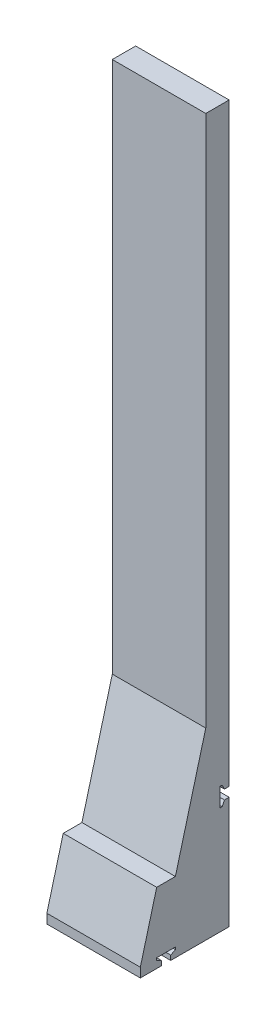
ISO-10303-21;
HEADER;
FILE_DESCRIPTION(('STEP AP214'),'2;1');
FILE_NAME('part.step','',(''),(''),'','','');
FILE_SCHEMA(('AUTOMOTIVE_DESIGN { 1 0 10303 214 1 1 1 1 }'));
ENDSEC;
DATA;
#1=APPLICATION_CONTEXT('core data for automotive mechanical design processes');
#2=APPLICATION_PROTOCOL_DEFINITION('international standard','automotive_design',2000,#1);
#3=PRODUCT_CONTEXT('',#1,'mechanical');
#4=PRODUCT('Part','Part','',(#3));
#5=PRODUCT_RELATED_PRODUCT_CATEGORY('part','',(#4));
#6=PRODUCT_DEFINITION_FORMATION('','',#4);
#7=PRODUCT_DEFINITION_CONTEXT('part definition',#1,'design');
#8=PRODUCT_DEFINITION('design','',#6,#7);
#9=PRODUCT_DEFINITION_SHAPE('','',#8);
#10=(LENGTH_UNIT() NAMED_UNIT(*) SI_UNIT(.MILLI.,.METRE.));
#11=(NAMED_UNIT(*) PLANE_ANGLE_UNIT() SI_UNIT($,.RADIAN.));
#12=(NAMED_UNIT(*) SI_UNIT($,.STERADIAN.) SOLID_ANGLE_UNIT());
#13=UNCERTAINTY_MEASURE_WITH_UNIT(LENGTH_MEASURE(1.E-05),#10,'distance_accuracy_value','');
#14=(GEOMETRIC_REPRESENTATION_CONTEXT(3) GLOBAL_UNCERTAINTY_ASSIGNED_CONTEXT((#13)) GLOBAL_UNIT_ASSIGNED_CONTEXT((#10,
#11,#12)) REPRESENTATION_CONTEXT('',''));
#15=CARTESIAN_POINT('',(0.,0.,0.));
#16=DIRECTION('',(0.,0.,1.));
#17=DIRECTION('',(1.,0.,0.));
#18=AXIS2_PLACEMENT_3D('',#15,#16,#17);
#19=CARTESIAN_POINT('',(1250.,50.,177.5));
#20=DIRECTION('',(0.,1.,0.));
#21=DIRECTION('',(0.,0.,1.));
#22=AXIS2_PLACEMENT_3D('',#19,#20,#21);
#23=PLANE('',#22);
#24=DIRECTION('',(0.,0.,-1.));
#25=VECTOR('',#24,1.);
#26=CARTESIAN_POINT('',(1150.,50.,177.5));
#27=LINE('',#26,#25);
#28=CARTESIAN_POINT('',(1150.,50.,200.));
#29=VERTEX_POINT('',#28);
#30=CARTESIAN_POINT('',(1150.,50.,177.5));
#31=VERTEX_POINT('',#30);
#32=EDGE_CURVE('E229',#29,#31,#27,.T.);
#33=ORIENTED_EDGE('',*,*,#32,.T.);
#34=DIRECTION('',(-1.,0.,0.));
#35=VECTOR('',#34,1.);
#36=CARTESIAN_POINT('',(1250.,50.,177.5));
#37=LINE('',#36,#35);
#38=CARTESIAN_POINT('',(1250.,50.,177.5));
#39=VERTEX_POINT('',#38);
#40=EDGE_CURVE('E11',#39,#31,#37,.T.);
#41=ORIENTED_EDGE('',*,*,#40,.F.);
#42=DIRECTION('',(0.,0.,-1.));
#43=VECTOR('',#42,1.);
#44=CARTESIAN_POINT('',(1250.,50.,177.5));
#45=LINE('',#44,#43);
#46=CARTESIAN_POINT('',(1250.,50.,200.));
#47=VERTEX_POINT('',#46);
#48=EDGE_CURVE('E275',#47,#39,#45,.T.);
#49=ORIENTED_EDGE('',*,*,#48,.F.);
#50=DIRECTION('',(-1.,0.,0.));
#51=VECTOR('',#50,1.);
#52=CARTESIAN_POINT('',(1250.,50.,200.));
#53=LINE('',#52,#51);
#54=EDGE_CURVE('E225',#47,#29,#53,.T.);
#55=ORIENTED_EDGE('',*,*,#54,.T.);
#56=EDGE_LOOP('',(#33,#41,#49,#55));
#57=FACE_BOUND('',#56,.T.);
#58=ADVANCED_FACE('F37',(#57),#23,.F.);
#59=CARTESIAN_POINT('',(1250.,55.,177.5));
#60=DIRECTION('',(0.,0.,1.));
#61=DIRECTION('',(1.,0.,0.));
#62=AXIS2_PLACEMENT_3D('',#59,#60,#61);
#63=PLANE('',#62);
#64=DIRECTION('',(0.,1.,0.));
#65=VECTOR('',#64,1.);
#66=CARTESIAN_POINT('',(1150.,55.,177.5));
#67=LINE('',#66,#65);
#68=CARTESIAN_POINT('',(1150.,55.,177.5));
#69=VERTEX_POINT('',#68);
#70=EDGE_CURVE('E232',#31,#69,#67,.T.);
#71=ORIENTED_EDGE('',*,*,#70,.T.);
#72=DIRECTION('',(-1.,0.,0.));
#73=VECTOR('',#72,1.);
#74=CARTESIAN_POINT('',(1250.,55.,177.5));
#75=LINE('',#74,#73);
#76=CARTESIAN_POINT('',(1250.,55.,177.5));
#77=VERTEX_POINT('',#76);
#78=EDGE_CURVE('E45',#77,#69,#75,.T.);
#79=ORIENTED_EDGE('',*,*,#78,.F.);
#80=DIRECTION('',(0.,1.,0.));
#81=VECTOR('',#80,1.);
#82=CARTESIAN_POINT('',(1250.,55.,177.5));
#83=LINE('',#82,#81);
#84=EDGE_CURVE('E144',#39,#77,#83,.T.);
#85=ORIENTED_EDGE('',*,*,#84,.F.);
#86=ORIENTED_EDGE('',*,*,#40,.T.);
#87=EDGE_LOOP('',(#71,#79,#85,#86));
#88=FACE_BOUND('',#87,.T.);
#89=ADVANCED_FACE('F413',(#88),#63,.F.);
#90=CARTESIAN_POINT('',(1250.,57.5,182.5));
#91=DIRECTION('',(0.,-0.894427190999916,0.447213595499958));
#92=DIRECTION('',(0.,-0.447213595499958,-0.894427190999916));
#93=AXIS2_PLACEMENT_3D('',#90,#91,#92);
#94=PLANE('',#93);
#95=DIRECTION('',(0.,0.447213595499958,0.894427190999916));
#96=VECTOR('',#95,1.);
#97=CARTESIAN_POINT('',(1150.,57.5,182.5));
#98=LINE('',#97,#96);
#99=CARTESIAN_POINT('',(1150.,57.5,182.5));
#100=VERTEX_POINT('',#99);
#101=EDGE_CURVE('E234',#69,#100,#98,.T.);
#102=ORIENTED_EDGE('',*,*,#101,.T.);
#103=DIRECTION('',(-1.,0.,0.));
#104=VECTOR('',#103,1.);
#105=CARTESIAN_POINT('',(1250.,57.5,182.5));
#106=LINE('',#105,#104);
#107=CARTESIAN_POINT('',(1250.,57.5,182.5));
#108=VERTEX_POINT('',#107);
#109=EDGE_CURVE('E330',#108,#100,#106,.T.);
#110=ORIENTED_EDGE('',*,*,#109,.F.);
#111=DIRECTION('',(0.,0.447213595499958,0.894427190999916));
#112=VECTOR('',#111,1.);
#113=CARTESIAN_POINT('',(1250.,57.5,182.5));
#114=LINE('',#113,#112);
#115=EDGE_CURVE('E338',#77,#108,#114,.T.);
#116=ORIENTED_EDGE('',*,*,#115,.F.);
#117=ORIENTED_EDGE('',*,*,#78,.T.);
#118=EDGE_LOOP('',(#102,#110,#116,#117));
#119=FACE_BOUND('',#118,.T.);
#120=ADVANCED_FACE('F336',(#119),#94,.F.);
#121=CARTESIAN_POINT('',(1250.,60.,182.5));
#122=DIRECTION('',(0.,0.,1.));
#123=DIRECTION('',(1.,0.,0.));
#124=AXIS2_PLACEMENT_3D('',#121,#122,#123);
#125=PLANE('',#124);
#126=DIRECTION('',(0.,1.,0.));
#127=VECTOR('',#126,1.);
#128=CARTESIAN_POINT('',(1150.,60.,182.5));
#129=LINE('',#128,#127);
#130=CARTESIAN_POINT('',(1150.,60.,182.5));
#131=VERTEX_POINT('',#130);
#132=EDGE_CURVE('E236',#100,#131,#129,.T.);
#133=ORIENTED_EDGE('',*,*,#132,.T.);
#134=DIRECTION('',(-1.,0.,0.));
#135=VECTOR('',#134,1.);
#136=CARTESIAN_POINT('',(1250.,60.,182.5));
#137=LINE('',#136,#135);
#138=CARTESIAN_POINT('',(1250.,60.,182.5));
#139=VERTEX_POINT('',#138);
#140=EDGE_CURVE('E327',#139,#131,#137,.T.);
#141=ORIENTED_EDGE('',*,*,#140,.F.);
#142=DIRECTION('',(0.,1.,0.));
#143=VECTOR('',#142,1.);
#144=CARTESIAN_POINT('',(1250.,60.,182.5));
#145=LINE('',#144,#143);
#146=EDGE_CURVE('E356',#108,#139,#145,.T.);
#147=ORIENTED_EDGE('',*,*,#146,.F.);
#148=ORIENTED_EDGE('',*,*,#109,.T.);
#149=EDGE_LOOP('',(#133,#141,#147,#148));
#150=FACE_BOUND('',#149,.T.);
#151=ADVANCED_FACE('F347',(#150),#125,.F.);
#152=CARTESIAN_POINT('',(1250.,60.,162.5));
#153=DIRECTION('',(0.,1.,0.));
#154=DIRECTION('',(0.,0.,1.));
#155=AXIS2_PLACEMENT_3D('',#152,#153,#154);
#156=PLANE('',#155);
#157=DIRECTION('',(0.,0.,-1.));
#158=VECTOR('',#157,1.);
#159=CARTESIAN_POINT('',(1150.,60.,162.5));
#160=LINE('',#159,#158);
#161=CARTESIAN_POINT('',(1150.,60.,162.5));
#162=VERTEX_POINT('',#161);
#163=EDGE_CURVE('E238',#131,#162,#160,.T.);
#164=ORIENTED_EDGE('',*,*,#163,.T.);
#165=DIRECTION('',(-1.,0.,0.));
#166=VECTOR('',#165,1.);
#167=CARTESIAN_POINT('',(1250.,60.,162.5));
#168=LINE('',#167,#166);
#169=CARTESIAN_POINT('',(1250.,60.,162.5));
#170=VERTEX_POINT('',#169);
#171=EDGE_CURVE('E324',#170,#162,#168,.T.);
#172=ORIENTED_EDGE('',*,*,#171,.F.);
#173=DIRECTION('',(0.,0.,-1.));
#174=VECTOR('',#173,1.);
#175=CARTESIAN_POINT('',(1250.,60.,162.5));
#176=LINE('',#175,#174);
#177=EDGE_CURVE('E353',#139,#170,#176,.T.);
#178=ORIENTED_EDGE('',*,*,#177,.F.);
#179=ORIENTED_EDGE('',*,*,#140,.T.);
#180=EDGE_LOOP('',(#164,#172,#178,#179));
#181=FACE_BOUND('',#180,.T.);
#182=ADVANCED_FACE('F351',(#181),#156,.F.);
#183=CARTESIAN_POINT('',(1250.,57.5,162.5));
#184=DIRECTION('',(0.,0.,-1.));
#185=DIRECTION('',(-1.,0.,0.));
#186=AXIS2_PLACEMENT_3D('',#183,#184,#185);
#187=PLANE('',#186);
#188=DIRECTION('',(0.,-1.,0.));
#189=VECTOR('',#188,1.);
#190=CARTESIAN_POINT('',(1150.,57.5,162.5));
#191=LINE('',#190,#189);
#192=CARTESIAN_POINT('',(1150.,57.5,162.5));
#193=VERTEX_POINT('',#192);
#194=EDGE_CURVE('E240',#162,#193,#191,.T.);
#195=ORIENTED_EDGE('',*,*,#194,.T.);
#196=DIRECTION('',(-1.,0.,0.));
#197=VECTOR('',#196,1.);
#198=CARTESIAN_POINT('',(1250.,57.5,162.5));
#199=LINE('',#198,#197);
#200=CARTESIAN_POINT('',(1250.,57.5,162.5));
#201=VERTEX_POINT('',#200);
#202=EDGE_CURVE('E321',#201,#193,#199,.T.);
#203=ORIENTED_EDGE('',*,*,#202,.F.);
#204=DIRECTION('',(0.,-1.,0.));
#205=VECTOR('',#204,1.);
#206=CARTESIAN_POINT('',(1250.,57.5,162.5));
#207=LINE('',#206,#205);
#208=EDGE_CURVE('E355',#170,#201,#207,.T.);
#209=ORIENTED_EDGE('',*,*,#208,.F.);
#210=ORIENTED_EDGE('',*,*,#171,.T.);
#211=EDGE_LOOP('',(#195,#203,#209,#210));
#212=FACE_BOUND('',#211,.T.);
#213=ADVANCED_FACE('F426',(#212),#187,.F.);
#214=CARTESIAN_POINT('',(1250.,55.,167.5));
#215=DIRECTION('',(0.,-0.894427190999916,-0.447213595499957));
#216=DIRECTION('',(0.,0.447213595499957,-0.894427190999916));
#217=AXIS2_PLACEMENT_3D('',#214,#215,#216);
#218=PLANE('',#217);
#219=DIRECTION('',(0.,-0.447213595499957,0.894427190999916));
#220=VECTOR('',#219,1.);
#221=CARTESIAN_POINT('',(1150.,55.,167.5));
#222=LINE('',#221,#220);
#223=CARTESIAN_POINT('',(1150.,55.,167.5));
#224=VERTEX_POINT('',#223);
#225=EDGE_CURVE('E242',#193,#224,#222,.T.);
#226=ORIENTED_EDGE('',*,*,#225,.T.);
#227=DIRECTION('',(-1.,0.,0.));
#228=VECTOR('',#227,1.);
#229=CARTESIAN_POINT('',(1250.,55.,167.5));
#230=LINE('',#229,#228);
#231=CARTESIAN_POINT('',(1250.,55.,167.5));
#232=VERTEX_POINT('',#231);
#233=EDGE_CURVE('E318',#232,#224,#230,.T.);
#234=ORIENTED_EDGE('',*,*,#233,.F.);
#235=DIRECTION('',(0.,-0.447213595499957,0.894427190999916));
#236=VECTOR('',#235,1.);
#237=CARTESIAN_POINT('',(1250.,55.,167.5));
#238=LINE('',#237,#236);
#239=EDGE_CURVE('E358',#201,#232,#238,.T.);
#240=ORIENTED_EDGE('',*,*,#239,.F.);
#241=ORIENTED_EDGE('',*,*,#202,.T.);
#242=EDGE_LOOP('',(#226,#234,#240,#241));
#243=FACE_BOUND('',#242,.T.);
#244=ADVANCED_FACE('F429',(#243),#218,.F.);
#245=CARTESIAN_POINT('',(1250.,50.,167.5));
#246=DIRECTION('',(0.,0.,-1.));
#247=DIRECTION('',(-1.,0.,0.));
#248=AXIS2_PLACEMENT_3D('',#245,#246,#247);
#249=PLANE('',#248);
#250=DIRECTION('',(0.,-1.,0.));
#251=VECTOR('',#250,1.);
#252=CARTESIAN_POINT('',(1150.,50.,167.5));
#253=LINE('',#252,#251);
#254=CARTESIAN_POINT('',(1150.,50.,167.5));
#255=VERTEX_POINT('',#254);
#256=EDGE_CURVE('E244',#224,#255,#253,.T.);
#257=ORIENTED_EDGE('',*,*,#256,.T.);
#258=DIRECTION('',(-1.,0.,0.));
#259=VECTOR('',#258,1.);
#260=CARTESIAN_POINT('',(1250.,50.,167.5));
#261=LINE('',#260,#259);
#262=CARTESIAN_POINT('',(1250.,50.,167.5));
#263=VERTEX_POINT('',#262);
#264=EDGE_CURVE('E315',#263,#255,#261,.T.);
#265=ORIENTED_EDGE('',*,*,#264,.F.);
#266=DIRECTION('',(0.,-1.,0.));
#267=VECTOR('',#266,1.);
#268=CARTESIAN_POINT('',(1250.,50.,167.5));
#269=LINE('',#268,#267);
#270=EDGE_CURVE('E364',#232,#263,#269,.T.);
#271=ORIENTED_EDGE('',*,*,#270,.F.);
#272=ORIENTED_EDGE('',*,*,#233,.T.);
#273=EDGE_LOOP('',(#257,#265,#271,#272));
#274=FACE_BOUND('',#273,.T.);
#275=ADVANCED_FACE('F433',(#274),#249,.F.);
#276=CARTESIAN_POINT('',(1250.,50.,105.));
#277=DIRECTION('',(0.,1.,0.));
#278=DIRECTION('',(0.,0.,1.));
#279=AXIS2_PLACEMENT_3D('',#276,#277,#278);
#280=PLANE('',#279);
#281=DIRECTION('',(0.,0.,-1.));
#282=VECTOR('',#281,1.);
#283=CARTESIAN_POINT('',(1150.,50.,105.));
#284=LINE('',#283,#282);
#285=CARTESIAN_POINT('',(1150.,50.,105.));
#286=VERTEX_POINT('',#285);
#287=EDGE_CURVE('E246',#255,#286,#284,.T.);
#288=ORIENTED_EDGE('',*,*,#287,.T.);
#289=DIRECTION('',(-1.,0.,0.));
#290=VECTOR('',#289,1.);
#291=CARTESIAN_POINT('',(1250.,50.,105.));
#292=LINE('',#291,#290);
#293=CARTESIAN_POINT('',(1250.,50.,105.));
#294=VERTEX_POINT('',#293);
#295=EDGE_CURVE('E312',#294,#286,#292,.T.);
#296=ORIENTED_EDGE('',*,*,#295,.F.);
#297=DIRECTION('',(0.,0.,-1.));
#298=VECTOR('',#297,1.);
#299=CARTESIAN_POINT('',(1250.,50.,105.));
#300=LINE('',#299,#298);
#301=EDGE_CURVE('E366',#263,#294,#300,.T.);
#302=ORIENTED_EDGE('',*,*,#301,.F.);
#303=ORIENTED_EDGE('',*,*,#264,.T.);
#304=EDGE_LOOP('',(#288,#296,#302,#303));
#305=FACE_BOUND('',#304,.T.);
#306=ADVANCED_FACE('F437',(#305),#280,.F.);
#307=CARTESIAN_POINT('',(1250.,170.,105.));
#308=DIRECTION('',(0.,0.,1.));
#309=DIRECTION('',(1.,0.,0.));
#310=AXIS2_PLACEMENT_3D('',#307,#308,#309);
#311=PLANE('',#310);
#312=DIRECTION('',(0.,1.,0.));
#313=VECTOR('',#312,1.);
#314=CARTESIAN_POINT('',(1150.,170.,105.));
#315=LINE('',#314,#313);
#316=CARTESIAN_POINT('',(1150.,170.,105.));
#317=VERTEX_POINT('',#316);
#318=EDGE_CURVE('E248',#286,#317,#315,.T.);
#319=ORIENTED_EDGE('',*,*,#318,.T.);
#320=DIRECTION('',(-1.,0.,0.));
#321=VECTOR('',#320,1.);
#322=CARTESIAN_POINT('',(1250.,170.,105.));
#323=LINE('',#322,#321);
#324=CARTESIAN_POINT('',(1250.,170.,105.));
#325=VERTEX_POINT('',#324);
#326=EDGE_CURVE('E309',#325,#317,#323,.T.);
#327=ORIENTED_EDGE('',*,*,#326,.F.);
#328=DIRECTION('',(0.,1.,0.));
#329=VECTOR('',#328,1.);
#330=CARTESIAN_POINT('',(1250.,170.,105.));
#331=LINE('',#330,#329);
#332=EDGE_CURVE('E368',#294,#325,#331,.T.);
#333=ORIENTED_EDGE('',*,*,#332,.F.);
#334=ORIENTED_EDGE('',*,*,#295,.T.);
#335=EDGE_LOOP('',(#319,#327,#333,#334));
#336=FACE_BOUND('',#335,.T.);
#337=ADVANCED_FACE('F441',(#336),#311,.F.);
#338=CARTESIAN_POINT('',(1250.,170.,110.));
#339=DIRECTION('',(0.,-1.,0.));
#340=DIRECTION('',(0.,0.,-1.));
#341=AXIS2_PLACEMENT_3D('',#338,#339,#340);
#342=PLANE('',#341);
#343=DIRECTION('',(0.,0.,1.));
#344=VECTOR('',#343,1.);
#345=CARTESIAN_POINT('',(1150.,170.,110.));
#346=LINE('',#345,#344);
#347=CARTESIAN_POINT('',(1150.,170.,110.));
#348=VERTEX_POINT('',#347);
#349=EDGE_CURVE('E250',#317,#348,#346,.T.);
#350=ORIENTED_EDGE('',*,*,#349,.T.);
#351=DIRECTION('',(-1.,0.,0.));
#352=VECTOR('',#351,1.);
#353=CARTESIAN_POINT('',(1250.,170.,110.));
#354=LINE('',#353,#352);
#355=CARTESIAN_POINT('',(1250.,170.,110.));
#356=VERTEX_POINT('',#355);
#357=EDGE_CURVE('E306',#356,#348,#354,.T.);
#358=ORIENTED_EDGE('',*,*,#357,.F.);
#359=DIRECTION('',(0.,0.,1.));
#360=VECTOR('',#359,1.);
#361=CARTESIAN_POINT('',(1250.,170.,110.));
#362=LINE('',#361,#360);
#363=EDGE_CURVE('E370',#325,#356,#362,.T.);
#364=ORIENTED_EDGE('',*,*,#363,.F.);
#365=ORIENTED_EDGE('',*,*,#326,.T.);
#366=EDGE_LOOP('',(#350,#358,#364,#365));
#367=FACE_BOUND('',#366,.T.);
#368=ADVANCED_FACE('F445',(#367),#342,.F.);
#369=CARTESIAN_POINT('',(1250.,165.,112.5));
#370=DIRECTION('',(0.,-0.44721359549996,-0.894427190999915));
#371=DIRECTION('',(0.,0.894427190999915,-0.44721359549996));
#372=AXIS2_PLACEMENT_3D('',#369,#370,#371);
#373=PLANE('',#372);
#374=DIRECTION('',(0.,-0.894427190999915,0.44721359549996));
#375=VECTOR('',#374,1.);
#376=CARTESIAN_POINT('',(1150.,165.,112.5));
#377=LINE('',#376,#375);
#378=CARTESIAN_POINT('',(1150.,165.,112.5));
#379=VERTEX_POINT('',#378);
#380=EDGE_CURVE('E252',#348,#379,#377,.T.);
#381=ORIENTED_EDGE('',*,*,#380,.T.);
#382=DIRECTION('',(-1.,0.,0.));
#383=VECTOR('',#382,1.);
#384=CARTESIAN_POINT('',(1250.,165.,112.5));
#385=LINE('',#384,#383);
#386=CARTESIAN_POINT('',(1250.,165.,112.5));
#387=VERTEX_POINT('',#386);
#388=EDGE_CURVE('E303',#387,#379,#385,.T.);
#389=ORIENTED_EDGE('',*,*,#388,.F.);
#390=DIRECTION('',(0.,-0.894427190999915,0.44721359549996));
#391=VECTOR('',#390,1.);
#392=CARTESIAN_POINT('',(1250.,165.,112.5));
#393=LINE('',#392,#391);
#394=EDGE_CURVE('E372',#356,#387,#393,.T.);
#395=ORIENTED_EDGE('',*,*,#394,.F.);
#396=ORIENTED_EDGE('',*,*,#357,.T.);
#397=EDGE_LOOP('',(#381,#389,#395,#396));
#398=FACE_BOUND('',#397,.T.);
#399=ADVANCED_FACE('F449',(#398),#373,.F.);
#400=CARTESIAN_POINT('',(1250.,165.,115.));
#401=DIRECTION('',(0.,-1.,0.));
#402=DIRECTION('',(0.,0.,-1.));
#403=AXIS2_PLACEMENT_3D('',#400,#401,#402);
#404=PLANE('',#403);
#405=DIRECTION('',(0.,0.,1.));
#406=VECTOR('',#405,1.);
#407=CARTESIAN_POINT('',(1150.,165.,115.));
#408=LINE('',#407,#406);
#409=CARTESIAN_POINT('',(1150.,165.,115.));
#410=VERTEX_POINT('',#409);
#411=EDGE_CURVE('E254',#379,#410,#408,.T.);
#412=ORIENTED_EDGE('',*,*,#411,.T.);
#413=DIRECTION('',(-1.,0.,0.));
#414=VECTOR('',#413,1.);
#415=CARTESIAN_POINT('',(1250.,165.,115.));
#416=LINE('',#415,#414);
#417=CARTESIAN_POINT('',(1250.,165.,115.));
#418=VERTEX_POINT('',#417);
#419=EDGE_CURVE('E300',#418,#410,#416,.T.);
#420=ORIENTED_EDGE('',*,*,#419,.F.);
#421=DIRECTION('',(0.,0.,1.));
#422=VECTOR('',#421,1.);
#423=CARTESIAN_POINT('',(1250.,165.,115.));
#424=LINE('',#423,#422);
#425=EDGE_CURVE('E374',#387,#418,#424,.T.);
#426=ORIENTED_EDGE('',*,*,#425,.F.);
#427=ORIENTED_EDGE('',*,*,#388,.T.);
#428=EDGE_LOOP('',(#412,#420,#426,#427));
#429=FACE_BOUND('',#428,.T.);
#430=ADVANCED_FACE('F453',(#429),#404,.F.);
#431=CARTESIAN_POINT('',(1250.,185.,115.));
#432=DIRECTION('',(0.,0.,1.));
#433=DIRECTION('',(1.,0.,0.));
#434=AXIS2_PLACEMENT_3D('',#431,#432,#433);
#435=PLANE('',#434);
#436=DIRECTION('',(0.,1.,0.));
#437=VECTOR('',#436,1.);
#438=CARTESIAN_POINT('',(1150.,185.,115.));
#439=LINE('',#438,#437);
#440=CARTESIAN_POINT('',(1150.,185.,115.));
#441=VERTEX_POINT('',#440);
#442=EDGE_CURVE('E256',#410,#441,#439,.T.);
#443=ORIENTED_EDGE('',*,*,#442,.T.);
#444=DIRECTION('',(-1.,0.,0.));
#445=VECTOR('',#444,1.);
#446=CARTESIAN_POINT('',(1250.,185.,115.));
#447=LINE('',#446,#445);
#448=CARTESIAN_POINT('',(1250.,185.,115.));
#449=VERTEX_POINT('',#448);
#450=EDGE_CURVE('E297',#449,#441,#447,.T.);
#451=ORIENTED_EDGE('',*,*,#450,.F.);
#452=DIRECTION('',(0.,1.,0.));
#453=VECTOR('',#452,1.);
#454=CARTESIAN_POINT('',(1250.,185.,115.));
#455=LINE('',#454,#453);
#456=EDGE_CURVE('E376',#418,#449,#455,.T.);
#457=ORIENTED_EDGE('',*,*,#456,.F.);
#458=ORIENTED_EDGE('',*,*,#419,.T.);
#459=EDGE_LOOP('',(#443,#451,#457,#458));
#460=FACE_BOUND('',#459,.T.);
#461=ADVANCED_FACE('F457',(#460),#435,.F.);
#462=CARTESIAN_POINT('',(1250.,185.,112.5));
#463=DIRECTION('',(0.,1.,0.));
#464=DIRECTION('',(0.,0.,1.));
#465=AXIS2_PLACEMENT_3D('',#462,#463,#464);
#466=PLANE('',#465);
#467=DIRECTION('',(0.,0.,-1.));
#468=VECTOR('',#467,1.);
#469=CARTESIAN_POINT('',(1150.,185.,112.5));
#470=LINE('',#469,#468);
#471=CARTESIAN_POINT('',(1150.,185.,112.5));
#472=VERTEX_POINT('',#471);
#473=EDGE_CURVE('E258',#441,#472,#470,.T.);
#474=ORIENTED_EDGE('',*,*,#473,.T.);
#475=DIRECTION('',(-1.,0.,0.));
#476=VECTOR('',#475,1.);
#477=CARTESIAN_POINT('',(1250.,185.,112.5));
#478=LINE('',#477,#476);
#479=CARTESIAN_POINT('',(1250.,185.,112.5));
#480=VERTEX_POINT('',#479);
#481=EDGE_CURVE('E294',#480,#472,#478,.T.);
#482=ORIENTED_EDGE('',*,*,#481,.F.);
#483=DIRECTION('',(0.,0.,-1.));
#484=VECTOR('',#483,1.);
#485=CARTESIAN_POINT('',(1250.,185.,112.5));
#486=LINE('',#485,#484);
#487=EDGE_CURVE('E378',#449,#480,#486,.T.);
#488=ORIENTED_EDGE('',*,*,#487,.F.);
#489=ORIENTED_EDGE('',*,*,#450,.T.);
#490=EDGE_LOOP('',(#474,#482,#488,#489));
#491=FACE_BOUND('',#490,.T.);
#492=ADVANCED_FACE('F461',(#491),#466,.F.);
#493=CARTESIAN_POINT('',(1250.,180.,110.));
#494=DIRECTION('',(0.,0.447213595499956,-0.894427190999917));
#495=DIRECTION('',(0.,0.894427190999917,0.447213595499956));
#496=AXIS2_PLACEMENT_3D('',#493,#494,#495);
#497=PLANE('',#496);
#498=DIRECTION('',(0.,-0.894427190999917,-0.447213595499956));
#499=VECTOR('',#498,1.);
#500=CARTESIAN_POINT('',(1150.,180.,110.));
#501=LINE('',#500,#499);
#502=CARTESIAN_POINT('',(1150.,180.,110.));
#503=VERTEX_POINT('',#502);
#504=EDGE_CURVE('E260',#472,#503,#501,.T.);
#505=ORIENTED_EDGE('',*,*,#504,.T.);
#506=DIRECTION('',(-1.,0.,0.));
#507=VECTOR('',#506,1.);
#508=CARTESIAN_POINT('',(1250.,180.,110.));
#509=LINE('',#508,#507);
#510=CARTESIAN_POINT('',(1250.,180.,110.));
#511=VERTEX_POINT('',#510);
#512=EDGE_CURVE('E291',#511,#503,#509,.T.);
#513=ORIENTED_EDGE('',*,*,#512,.F.);
#514=DIRECTION('',(0.,-0.894427190999917,-0.447213595499956));
#515=VECTOR('',#514,1.);
#516=CARTESIAN_POINT('',(1250.,180.,110.));
#517=LINE('',#516,#515);
#518=EDGE_CURVE('E380',#480,#511,#517,.T.);
#519=ORIENTED_EDGE('',*,*,#518,.F.);
#520=ORIENTED_EDGE('',*,*,#481,.T.);
#521=EDGE_LOOP('',(#505,#513,#519,#520));
#522=FACE_BOUND('',#521,.T.);
#523=ADVANCED_FACE('F465',(#522),#497,.F.);
#524=CARTESIAN_POINT('',(1250.,180.,105.));
#525=DIRECTION('',(0.,1.,0.));
#526=DIRECTION('',(0.,0.,1.));
#527=AXIS2_PLACEMENT_3D('',#524,#525,#526);
#528=PLANE('',#527);
#529=DIRECTION('',(0.,0.,-1.));
#530=VECTOR('',#529,1.);
#531=CARTESIAN_POINT('',(1150.,180.,105.));
#532=LINE('',#531,#530);
#533=CARTESIAN_POINT('',(1150.,180.,105.));
#534=VERTEX_POINT('',#533);
#535=EDGE_CURVE('E262',#503,#534,#532,.T.);
#536=ORIENTED_EDGE('',*,*,#535,.T.);
#537=DIRECTION('',(-1.,0.,0.));
#538=VECTOR('',#537,1.);
#539=CARTESIAN_POINT('',(1250.,180.,105.));
#540=LINE('',#539,#538);
#541=CARTESIAN_POINT('',(1250.,180.,105.));
#542=VERTEX_POINT('',#541);
#543=EDGE_CURVE('E288',#542,#534,#540,.T.);
#544=ORIENTED_EDGE('',*,*,#543,.F.);
#545=DIRECTION('',(0.,0.,-1.));
#546=VECTOR('',#545,1.);
#547=CARTESIAN_POINT('',(1250.,180.,105.));
#548=LINE('',#547,#546);
#549=EDGE_CURVE('E382',#511,#542,#548,.T.);
#550=ORIENTED_EDGE('',*,*,#549,.F.);
#551=ORIENTED_EDGE('',*,*,#512,.T.);
#552=EDGE_LOOP('',(#536,#544,#550,#551));
#553=FACE_BOUND('',#552,.T.);
#554=ADVANCED_FACE('F469',(#553),#528,.F.);
#555=CARTESIAN_POINT('',(1250.,816.139219029596,105.));
#556=DIRECTION('',(0.,0.,1.));
#557=DIRECTION('',(0.,-1.,0.));
#558=AXIS2_PLACEMENT_3D('',#555,#556,#557);
#559=PLANE('',#558);
#560=DIRECTION('',(0.,1.,0.));
#561=VECTOR('',#560,1.);
#562=CARTESIAN_POINT('',(1150.,816.139219029596,105.));
#563=LINE('',#562,#561);
#564=CARTESIAN_POINT('',(1150.,816.139219029596,105.));
#565=VERTEX_POINT('',#564);
#566=EDGE_CURVE('E264',#534,#565,#563,.T.);
#567=ORIENTED_EDGE('',*,*,#566,.T.);
#568=DIRECTION('',(-1.,0.,0.));
#569=VECTOR('',#568,1.);
#570=CARTESIAN_POINT('',(1250.,816.139219029596,105.));
#571=LINE('',#570,#569);
#572=CARTESIAN_POINT('',(1250.,816.139219029596,105.));
#573=VERTEX_POINT('',#572);
#574=EDGE_CURVE('E285',#573,#565,#571,.T.);
#575=ORIENTED_EDGE('',*,*,#574,.F.);
#576=DIRECTION('',(0.,1.,0.));
#577=VECTOR('',#576,1.);
#578=CARTESIAN_POINT('',(1250.,816.139219029596,105.));
#579=LINE('',#578,#577);
#580=EDGE_CURVE('E384',#542,#573,#579,.T.);
#581=ORIENTED_EDGE('',*,*,#580,.F.);
#582=ORIENTED_EDGE('',*,*,#543,.T.);
#583=EDGE_LOOP('',(#567,#575,#581,#582));
#584=FACE_BOUND('',#583,.T.);
#585=ADVANCED_FACE('F473',(#584),#559,.F.);
#586=CARTESIAN_POINT('',(1250.,816.139219029596,130.));
#587=DIRECTION('',(0.,-1.,0.));
#588=DIRECTION('',(0.,0.,-1.));
#589=AXIS2_PLACEMENT_3D('',#586,#587,#588);
#590=PLANE('',#589);
#591=DIRECTION('',(0.,0.,1.));
#592=VECTOR('',#591,1.);
#593=CARTESIAN_POINT('',(1150.,816.139219029596,130.));
#594=LINE('',#593,#592);
#595=CARTESIAN_POINT('',(1150.,816.139219029596,130.));
#596=VERTEX_POINT('',#595);
#597=EDGE_CURVE('E266',#565,#596,#594,.T.);
#598=ORIENTED_EDGE('',*,*,#597,.T.);
#599=DIRECTION('',(-1.,0.,0.));
#600=VECTOR('',#599,1.);
#601=CARTESIAN_POINT('',(1250.,816.139219029596,130.));
#602=LINE('',#601,#600);
#603=CARTESIAN_POINT('',(1250.,816.139219029596,130.));
#604=VERTEX_POINT('',#603);
#605=EDGE_CURVE('E282',#604,#596,#602,.T.);
#606=ORIENTED_EDGE('',*,*,#605,.F.);
#607=DIRECTION('',(0.,0.,1.));
#608=VECTOR('',#607,1.);
#609=CARTESIAN_POINT('',(1250.,816.139219029596,130.));
#610=LINE('',#609,#608);
#611=EDGE_CURVE('E386',#573,#604,#610,.T.);
#612=ORIENTED_EDGE('',*,*,#611,.F.);
#613=ORIENTED_EDGE('',*,*,#574,.T.);
#614=EDGE_LOOP('',(#598,#606,#612,#613));
#615=FACE_BOUND('',#614,.T.);
#616=ADVANCED_FACE('F477',(#615),#590,.F.);
#617=CARTESIAN_POINT('',(1250.,246.602540378441,130.));
#618=DIRECTION('',(0.,0.,-1.));
#619=DIRECTION('',(-1.,0.,0.));
#620=AXIS2_PLACEMENT_3D('',#617,#618,#619);
#621=PLANE('',#620);
#622=DIRECTION('',(0.,-1.,0.));
#623=VECTOR('',#622,1.);
#624=CARTESIAN_POINT('',(1150.,246.602540378441,130.));
#625=LINE('',#624,#623);
#626=CARTESIAN_POINT('',(1150.,246.602540378441,130.));
#627=VERTEX_POINT('',#626);
#628=EDGE_CURVE('E268',#596,#627,#625,.T.);
#629=ORIENTED_EDGE('',*,*,#628,.T.);
#630=DIRECTION('',(-1.,0.,0.));
#631=VECTOR('',#630,1.);
#632=CARTESIAN_POINT('',(1250.,246.602540378441,130.));
#633=LINE('',#632,#631);
#634=CARTESIAN_POINT('',(1250.,246.602540378441,130.));
#635=VERTEX_POINT('',#634);
#636=EDGE_CURVE('E279',#635,#627,#633,.T.);
#637=ORIENTED_EDGE('',*,*,#636,.F.);
#638=DIRECTION('',(0.,-1.,0.));
#639=VECTOR('',#638,1.);
#640=CARTESIAN_POINT('',(1250.,246.602540378441,130.));
#641=LINE('',#640,#639);
#642=EDGE_CURVE('E388',#604,#635,#641,.T.);
#643=ORIENTED_EDGE('',*,*,#642,.F.);
#644=ORIENTED_EDGE('',*,*,#605,.T.);
#645=EDGE_LOOP('',(#629,#637,#643,#644));
#646=FACE_BOUND('',#645,.T.);
#647=ADVANCED_FACE('F394',(#646),#621,.F.);
#648=CARTESIAN_POINT('',(1250.,125.310889132454,162.5));
#649=DIRECTION('',(0.,-0.258819045102525,-0.965925826289067));
#650=DIRECTION('',(0.,0.965925826289067,-0.258819045102525));
#651=AXIS2_PLACEMENT_3D('',#648,#649,#650);
#652=PLANE('',#651);
#653=DIRECTION('',(0.,-0.965925826289067,0.258819045102525));
#654=VECTOR('',#653,1.);
#655=CARTESIAN_POINT('',(1150.,125.310889132454,162.5));
#656=LINE('',#655,#654);
#657=CARTESIAN_POINT('',(1150.,125.310889132454,162.5));
#658=VERTEX_POINT('',#657);
#659=EDGE_CURVE('E270',#627,#658,#656,.T.);
#660=ORIENTED_EDGE('',*,*,#659,.T.);
#661=DIRECTION('',(-1.,0.,0.));
#662=VECTOR('',#661,1.);
#663=CARTESIAN_POINT('',(1250.,125.310889132454,162.5));
#664=LINE('',#663,#662);
#665=CARTESIAN_POINT('',(1250.,125.310889132454,162.5));
#666=VERTEX_POINT('',#665);
#667=EDGE_CURVE('E220',#666,#658,#664,.T.);
#668=ORIENTED_EDGE('',*,*,#667,.F.);
#669=DIRECTION('',(0.,-0.965925826289067,0.258819045102525));
#670=VECTOR('',#669,1.);
#671=CARTESIAN_POINT('',(1250.,125.310889132454,162.5));
#672=LINE('',#671,#670);
#673=EDGE_CURVE('E211',#635,#666,#672,.T.);
#674=ORIENTED_EDGE('',*,*,#673,.F.);
#675=ORIENTED_EDGE('',*,*,#636,.T.);
#676=EDGE_LOOP('',(#660,#668,#674,#675));
#677=FACE_BOUND('',#676,.T.);
#678=ADVANCED_FACE('F398',(#677),#652,.F.);
#679=CARTESIAN_POINT('',(1250.,125.310889132454,182.5));
#680=DIRECTION('',(0.,-1.,0.));
#681=DIRECTION('',(0.,0.,-1.));
#682=AXIS2_PLACEMENT_3D('',#679,#680,#681);
#683=PLANE('',#682);
#684=DIRECTION('',(0.,0.,1.));
#685=VECTOR('',#684,1.);
#686=CARTESIAN_POINT('',(1150.,125.310889132454,182.5));
#687=LINE('',#686,#685);
#688=CARTESIAN_POINT('',(1150.,125.310889132454,182.5));
#689=VERTEX_POINT('',#688);
#690=EDGE_CURVE('E219',#658,#689,#687,.T.);
#691=ORIENTED_EDGE('',*,*,#690,.T.);
#692=DIRECTION('',(-1.,0.,0.));
#693=VECTOR('',#692,1.);
#694=CARTESIAN_POINT('',(1250.,125.310889132454,182.5));
#695=LINE('',#694,#693);
#696=CARTESIAN_POINT('',(1250.,125.310889132454,182.5));
#697=VERTEX_POINT('',#696);
#698=EDGE_CURVE('E216',#697,#689,#695,.T.);
#699=ORIENTED_EDGE('',*,*,#698,.F.);
#700=DIRECTION('',(0.,0.,1.));
#701=VECTOR('',#700,1.);
#702=CARTESIAN_POINT('',(1250.,125.310889132454,182.5));
#703=LINE('',#702,#701);
#704=EDGE_CURVE('E205',#666,#697,#703,.T.);
#705=ORIENTED_EDGE('',*,*,#704,.F.);
#706=ORIENTED_EDGE('',*,*,#667,.T.);
#707=EDGE_LOOP('',(#691,#699,#705,#706));
#708=FACE_BOUND('',#707,.T.);
#709=ADVANCED_FACE('F217',(#708),#683,.F.);
#710=CARTESIAN_POINT('',(1250.,60.,200.));
#711=DIRECTION('',(0.,-0.258819045102525,-0.965925826289067));
#712=DIRECTION('',(0.,0.965925826289067,-0.258819045102525));
#713=AXIS2_PLACEMENT_3D('',#710,#711,#712);
#714=PLANE('',#713);
#715=DIRECTION('',(0.,-0.965925826289067,0.258819045102525));
#716=VECTOR('',#715,1.);
#717=CARTESIAN_POINT('',(1150.,60.,200.));
#718=LINE('',#717,#716);
#719=CARTESIAN_POINT('',(1150.,60.,200.));
#720=VERTEX_POINT('',#719);
#721=EDGE_CURVE('E130',#689,#720,#718,.T.);
#722=ORIENTED_EDGE('',*,*,#721,.T.);
#723=DIRECTION('',(-1.,0.,0.));
#724=VECTOR('',#723,1.);
#725=CARTESIAN_POINT('',(1250.,60.,200.));
#726=LINE('',#725,#724);
#727=CARTESIAN_POINT('',(1250.,60.,200.));
#728=VERTEX_POINT('',#727);
#729=EDGE_CURVE('E221',#728,#720,#726,.T.);
#730=ORIENTED_EDGE('',*,*,#729,.F.);
#731=DIRECTION('',(0.,-0.965925826289067,0.258819045102525));
#732=VECTOR('',#731,1.);
#733=CARTESIAN_POINT('',(1250.,60.,200.));
#734=LINE('',#733,#732);
#735=EDGE_CURVE('E209',#697,#728,#734,.T.);
#736=ORIENTED_EDGE('',*,*,#735,.F.);
#737=ORIENTED_EDGE('',*,*,#698,.T.);
#738=EDGE_LOOP('',(#722,#730,#736,#737));
#739=FACE_BOUND('',#738,.T.);
#740=ADVANCED_FACE('F223',(#739),#714,.F.);
#741=CARTESIAN_POINT('',(1250.,50.,200.));
#742=DIRECTION('',(0.,0.,-1.));
#743=DIRECTION('',(-1.,0.,0.));
#744=AXIS2_PLACEMENT_3D('',#741,#742,#743);
#745=PLANE('',#744);
#746=DIRECTION('',(0.,-1.,0.));
#747=VECTOR('',#746,1.);
#748=CARTESIAN_POINT('',(1150.,50.,200.));
#749=LINE('',#748,#747);
#750=EDGE_CURVE('E136',#720,#29,#749,.T.);
#751=ORIENTED_EDGE('',*,*,#750,.T.);
#752=ORIENTED_EDGE('',*,*,#54,.F.);
#753=DIRECTION('',(0.,-1.,0.));
#754=VECTOR('',#753,1.);
#755=CARTESIAN_POINT('',(1250.,50.,200.));
#756=LINE('',#755,#754);
#757=EDGE_CURVE('E53',#728,#47,#756,.T.);
#758=ORIENTED_EDGE('',*,*,#757,.F.);
#759=ORIENTED_EDGE('',*,*,#729,.T.);
#760=EDGE_LOOP('',(#751,#752,#758,#759));
#761=FACE_BOUND('',#760,.T.);
#762=ADVANCED_FACE('F402',(#761),#745,.F.);
#763=CARTESIAN_POINT('',(1250.,0.,0.));
#764=DIRECTION('',(-1.,0.,0.));
#765=DIRECTION('',(0.,0.,1.));
#766=AXIS2_PLACEMENT_3D('',#763,#764,#765);
#767=PLANE('',#766);
#768=ORIENTED_EDGE('',*,*,#48,.T.);
#769=ORIENTED_EDGE('',*,*,#84,.T.);
#770=ORIENTED_EDGE('',*,*,#115,.T.);
#771=ORIENTED_EDGE('',*,*,#146,.T.);
#772=ORIENTED_EDGE('',*,*,#177,.T.);
#773=ORIENTED_EDGE('',*,*,#208,.T.);
#774=ORIENTED_EDGE('',*,*,#239,.T.);
#775=ORIENTED_EDGE('',*,*,#270,.T.);
#776=ORIENTED_EDGE('',*,*,#301,.T.);
#777=ORIENTED_EDGE('',*,*,#332,.T.);
#778=ORIENTED_EDGE('',*,*,#363,.T.);
#779=ORIENTED_EDGE('',*,*,#394,.T.);
#780=ORIENTED_EDGE('',*,*,#425,.T.);
#781=ORIENTED_EDGE('',*,*,#456,.T.);
#782=ORIENTED_EDGE('',*,*,#487,.T.);
#783=ORIENTED_EDGE('',*,*,#518,.T.);
#784=ORIENTED_EDGE('',*,*,#549,.T.);
#785=ORIENTED_EDGE('',*,*,#580,.T.);
#786=ORIENTED_EDGE('',*,*,#611,.T.);
#787=ORIENTED_EDGE('',*,*,#642,.T.);
#788=ORIENTED_EDGE('',*,*,#673,.T.);
#789=ORIENTED_EDGE('',*,*,#704,.T.);
#790=ORIENTED_EDGE('',*,*,#735,.T.);
#791=ORIENTED_EDGE('',*,*,#757,.T.);
#792=EDGE_LOOP('',(#768,#769,#770,#771,#772,#773,#774,#775,#776,#777,#778,#779,#780,#781,#782,
#783,#784,#785,#786,#787,#788,#789,#790,#791));
#793=FACE_BOUND('',#792,.T.);
#794=ADVANCED_FACE('F207',(#793),#767,.F.);
#795=CARTESIAN_POINT('',(1150.,0.,0.));
#796=DIRECTION('',(-1.,0.,0.));
#797=DIRECTION('',(0.,0.,1.));
#798=AXIS2_PLACEMENT_3D('',#795,#796,#797);
#799=PLANE('',#798);
#800=ORIENTED_EDGE('',*,*,#32,.F.);
#801=ORIENTED_EDGE('',*,*,#750,.F.);
#802=ORIENTED_EDGE('',*,*,#721,.F.);
#803=ORIENTED_EDGE('',*,*,#690,.F.);
#804=ORIENTED_EDGE('',*,*,#659,.F.);
#805=ORIENTED_EDGE('',*,*,#628,.F.);
#806=ORIENTED_EDGE('',*,*,#597,.F.);
#807=ORIENTED_EDGE('',*,*,#566,.F.);
#808=ORIENTED_EDGE('',*,*,#535,.F.);
#809=ORIENTED_EDGE('',*,*,#504,.F.);
#810=ORIENTED_EDGE('',*,*,#473,.F.);
#811=ORIENTED_EDGE('',*,*,#442,.F.);
#812=ORIENTED_EDGE('',*,*,#411,.F.);
#813=ORIENTED_EDGE('',*,*,#380,.F.);
#814=ORIENTED_EDGE('',*,*,#349,.F.);
#815=ORIENTED_EDGE('',*,*,#318,.F.);
#816=ORIENTED_EDGE('',*,*,#287,.F.);
#817=ORIENTED_EDGE('',*,*,#256,.F.);
#818=ORIENTED_EDGE('',*,*,#225,.F.);
#819=ORIENTED_EDGE('',*,*,#194,.F.);
#820=ORIENTED_EDGE('',*,*,#163,.F.);
#821=ORIENTED_EDGE('',*,*,#132,.F.);
#822=ORIENTED_EDGE('',*,*,#101,.F.);
#823=ORIENTED_EDGE('',*,*,#70,.F.);
#824=EDGE_LOOP('',(#800,#801,#802,#803,#804,#805,#806,#807,#808,#809,#810,#811,#812,#813,#814,
#815,#816,#817,#818,#819,#820,#821,#822,#823));
#825=FACE_BOUND('',#824,.T.);
#826=ADVANCED_FACE('F342',(#825),#799,.T.);
#827=CLOSED_SHELL('',(#58,#89,#120,#151,#182,#213,#244,#275,#306,#337,#368,#399,#430,#461,#492,
#523,#554,#585,#616,#647,#678,#709,#740,#762,#794,#826));
#828=MANIFOLD_SOLID_BREP('B2',#827);
#829=ADVANCED_BREP_SHAPE_REPRESENTATION('',(#18,#828),#14);
#830=SHAPE_DEFINITION_REPRESENTATION(#9,#829);
ENDSEC;
END-ISO-10303-21;
